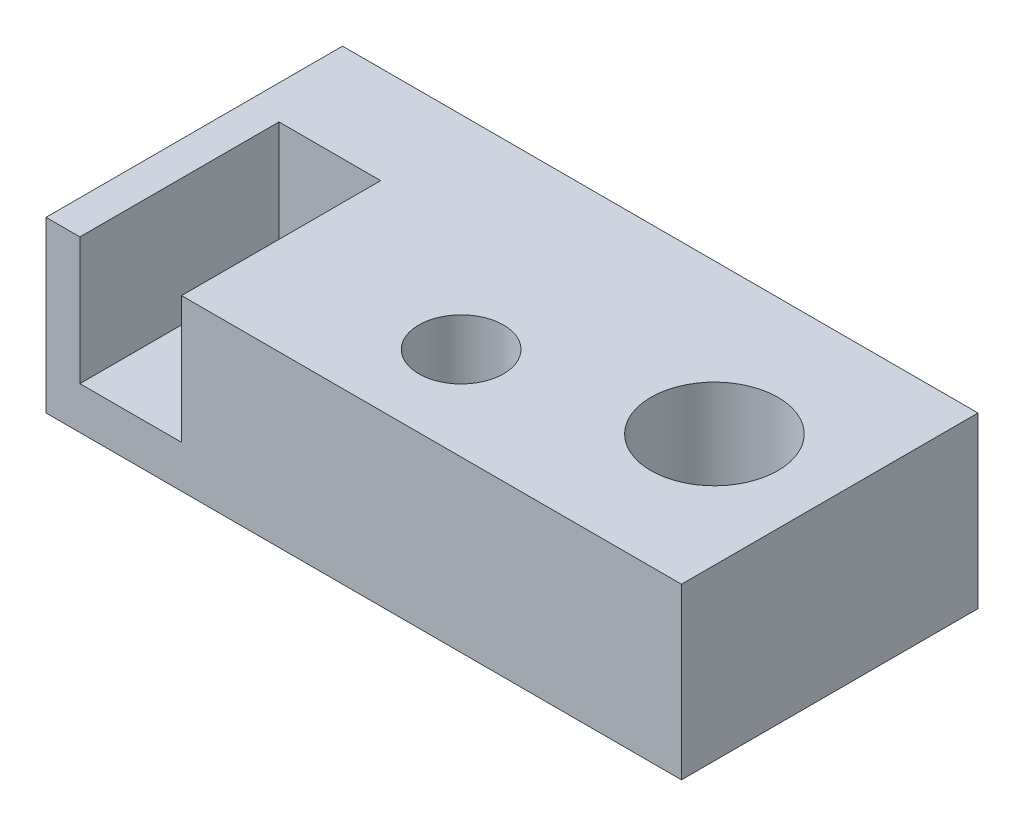
ISO-10303-21;
HEADER;
FILE_DESCRIPTION(('STEP AP214'),'2;1');
FILE_NAME('part.step','',(''),(''),'','','');
FILE_SCHEMA(('AUTOMOTIVE_DESIGN { 1 0 10303 214 1 1 1 1 }'));
ENDSEC;
DATA;
#1=APPLICATION_CONTEXT('core data for automotive mechanical design processes');
#2=APPLICATION_PROTOCOL_DEFINITION('international standard','automotive_design',2000,#1);
#3=PRODUCT_CONTEXT('',#1,'mechanical');
#4=PRODUCT('Part','Part','',(#3));
#5=PRODUCT_RELATED_PRODUCT_CATEGORY('part','',(#4));
#6=PRODUCT_DEFINITION_FORMATION('','',#4);
#7=PRODUCT_DEFINITION_CONTEXT('part definition',#1,'design');
#8=PRODUCT_DEFINITION('design','',#6,#7);
#9=PRODUCT_DEFINITION_SHAPE('','',#8);
#10=(LENGTH_UNIT() NAMED_UNIT(*) SI_UNIT(.MILLI.,.METRE.));
#11=(NAMED_UNIT(*) PLANE_ANGLE_UNIT() SI_UNIT($,.RADIAN.));
#12=(NAMED_UNIT(*) SI_UNIT($,.STERADIAN.) SOLID_ANGLE_UNIT());
#13=UNCERTAINTY_MEASURE_WITH_UNIT(LENGTH_MEASURE(1.E-05),#10,'distance_accuracy_value','');
#14=(GEOMETRIC_REPRESENTATION_CONTEXT(3) GLOBAL_UNCERTAINTY_ASSIGNED_CONTEXT((#13)) GLOBAL_UNIT_ASSIGNED_CONTEXT((#10,
#11,#12)) REPRESENTATION_CONTEXT('',''));
#15=CARTESIAN_POINT('',(0.,0.,0.));
#16=DIRECTION('',(0.,0.,1.));
#17=DIRECTION('',(1.,0.,0.));
#18=AXIS2_PLACEMENT_3D('',#15,#16,#17);
#19=CARTESIAN_POINT('',(0.,20.,0.));
#20=DIRECTION('',(0.,-1.,0.));
#21=DIRECTION('',(0.,0.,1.));
#22=AXIS2_PLACEMENT_3D('',#19,#20,#21);
#23=PLANE('',#22);
#24=CARTESIAN_POINT('',(0.5,20.,6.50000000000017));
#25=DIRECTION('',(0.,-1.,0.));
#26=DIRECTION('',(0.,0.,-1.));
#27=AXIS2_PLACEMENT_3D('',#24,#25,#26);
#28=CIRCLE('',#27,5.);
#29=CARTESIAN_POINT('',(0.5,20.,1.50000000000017));
#30=VERTEX_POINT('',#29);
#31=EDGE_CURVE('E139',#30,#30,#28,.T.);
#32=ORIENTED_EDGE('',*,*,#31,.T.);
#33=EDGE_LOOP('',(#32));
#34=FACE_BOUND('',#33,.T.);
#35=CARTESIAN_POINT('',(24.0874160820902,20.,0.196874766099198));
#36=DIRECTION('',(0.,-1.,0.));
#37=DIRECTION('',(0.,0.,-1.));
#38=AXIS2_PLACEMENT_3D('',#35,#36,#37);
#39=CIRCLE('',#38,7.5);
#40=CARTESIAN_POINT('',(24.0874160820902,20.,-7.3031252339008));
#41=VERTEX_POINT('',#40);
#42=EDGE_CURVE('E160',#41,#41,#39,.T.);
#43=ORIENTED_EDGE('',*,*,#42,.T.);
#44=EDGE_LOOP('',(#43));
#45=FACE_BOUND('',#44,.T.);
#46=DIRECTION('',(0.,0.,-1.));
#47=VECTOR('',#46,1.);
#48=CARTESIAN_POINT('',(-33.5,20.,17.5));
#49=LINE('',#48,#47);
#50=CARTESIAN_POINT('',(-33.5,20.,17.5));
#51=VERTEX_POINT('',#50);
#52=CARTESIAN_POINT('',(-33.5,20.,-5.99999999999999));
#53=VERTEX_POINT('',#52);
#54=EDGE_CURVE('E144',#51,#53,#49,.T.);
#55=ORIENTED_EDGE('',*,*,#54,.T.);
#56=DIRECTION('',(1.,0.,0.));
#57=VECTOR('',#56,1.);
#58=CARTESIAN_POINT('',(-33.5,20.,-5.99999999999999));
#59=LINE('',#58,#57);
#60=CARTESIAN_POINT('',(-21.5,20.,-5.99999999999999));
#61=VERTEX_POINT('',#60);
#62=EDGE_CURVE('E124',#53,#61,#59,.T.);
#63=ORIENTED_EDGE('',*,*,#62,.T.);
#64=DIRECTION('',(0.,0.,1.));
#65=VECTOR('',#64,1.);
#66=CARTESIAN_POINT('',(-21.5,20.,17.5));
#67=LINE('',#66,#65);
#68=CARTESIAN_POINT('',(-21.5,20.,17.5));
#69=VERTEX_POINT('',#68);
#70=EDGE_CURVE('E134',#61,#69,#67,.T.);
#71=ORIENTED_EDGE('',*,*,#70,.T.);
#72=DIRECTION('',(-1.,0.,0.));
#73=VECTOR('',#72,1.);
#74=CARTESIAN_POINT('',(-37.5,20.,17.5));
#75=LINE('',#74,#73);
#76=CARTESIAN_POINT('',(37.5,20.,17.5));
#77=VERTEX_POINT('',#76);
#78=EDGE_CURVE('E167',#77,#69,#75,.T.);
#79=ORIENTED_EDGE('',*,*,#78,.F.);
#80=DIRECTION('',(0.,0.,1.));
#81=VECTOR('',#80,1.);
#82=CARTESIAN_POINT('',(37.5,20.,-17.5));
#83=LINE('',#82,#81);
#84=CARTESIAN_POINT('',(37.5,20.,-17.5));
#85=VERTEX_POINT('',#84);
#86=EDGE_CURVE('E164',#85,#77,#83,.T.);
#87=ORIENTED_EDGE('',*,*,#86,.F.);
#88=DIRECTION('',(1.,0.,0.));
#89=VECTOR('',#88,1.);
#90=CARTESIAN_POINT('',(-37.5,20.,-17.5));
#91=LINE('',#90,#89);
#92=CARTESIAN_POINT('',(-37.5,20.,-17.5));
#93=VERTEX_POINT('',#92);
#94=EDGE_CURVE('E175',#93,#85,#91,.T.);
#95=ORIENTED_EDGE('',*,*,#94,.F.);
#96=DIRECTION('',(0.,0.,-1.));
#97=VECTOR('',#96,1.);
#98=CARTESIAN_POINT('',(-37.5,20.,-17.5));
#99=LINE('',#98,#97);
#100=CARTESIAN_POINT('',(-37.5,20.,17.5));
#101=VERTEX_POINT('',#100);
#102=EDGE_CURVE('E170',#101,#93,#99,.T.);
#103=ORIENTED_EDGE('',*,*,#102,.F.);
#104=EDGE_CURVE('E165',#51,#101,#75,.T.);
#105=ORIENTED_EDGE('',*,*,#104,.F.);
#106=EDGE_LOOP('',(#55,#63,#71,#79,#87,#95,#103,#105));
#107=FACE_BOUND('',#106,.T.);
#108=ADVANCED_FACE('F41',(#34,#45,#107),#23,.F.);
#109=CARTESIAN_POINT('',(-27.5,20.,0.196874766099198));
#110=DIRECTION('',(0.,-1.,0.));
#111=DIRECTION('',(0.,0.,1.));
#112=AXIS2_PLACEMENT_3D('',#109,#110,#111);
#113=CYLINDRICAL_SURFACE('',#112,4.);
#114=CARTESIAN_POINT('',(-27.5,0.,0.196874766099198));
#115=DIRECTION('',(0.,-1.,0.));
#116=DIRECTION('',(0.,0.,-1.));
#117=AXIS2_PLACEMENT_3D('',#114,#115,#116);
#118=CIRCLE('',#117,4.);
#119=CARTESIAN_POINT('',(-27.5,0.,-3.8031252339008));
#120=VERTEX_POINT('',#119);
#121=EDGE_CURVE('E154',#120,#120,#118,.T.);
#122=ORIENTED_EDGE('',*,*,#121,.T.);
#123=EDGE_LOOP('',(#122));
#124=FACE_BOUND('',#123,.T.);
#125=CARTESIAN_POINT('',(-27.5,5.,0.196874766099198));
#126=DIRECTION('',(0.,-1.,0.));
#127=DIRECTION('',(0.,0.,-1.));
#128=AXIS2_PLACEMENT_3D('',#125,#126,#127);
#129=CIRCLE('',#128,4.);
#130=CARTESIAN_POINT('',(-27.5,5.,-3.8031252339008));
#131=VERTEX_POINT('',#130);
#132=EDGE_CURVE('E44',#131,#131,#129,.T.);
#133=ORIENTED_EDGE('',*,*,#132,.F.);
#134=EDGE_LOOP('',(#133));
#135=FACE_BOUND('',#134,.T.);
#136=ADVANCED_FACE('F214',(#124,#135),#113,.F.);
#137=CARTESIAN_POINT('',(0.,0.,0.));
#138=DIRECTION('',(0.,-1.,0.));
#139=DIRECTION('',(0.,0.,1.));
#140=AXIS2_PLACEMENT_3D('',#137,#138,#139);
#141=PLANE('',#140);
#142=CARTESIAN_POINT('',(0.5,0.,6.50000000000017));
#143=DIRECTION('',(0.,-1.,0.));
#144=DIRECTION('',(0.,0.,-1.));
#145=AXIS2_PLACEMENT_3D('',#142,#143,#144);
#146=CIRCLE('',#145,5.);
#147=CARTESIAN_POINT('',(0.5,0.,1.50000000000017));
#148=VERTEX_POINT('',#147);
#149=EDGE_CURVE('E150',#148,#148,#146,.T.);
#150=ORIENTED_EDGE('',*,*,#149,.F.);
#151=EDGE_LOOP('',(#150));
#152=FACE_BOUND('',#151,.T.);
#153=CARTESIAN_POINT('',(24.0874160820902,0.,0.196874766099198));
#154=DIRECTION('',(0.,-1.,0.));
#155=DIRECTION('',(0.,0.,-1.));
#156=AXIS2_PLACEMENT_3D('',#153,#154,#155);
#157=CIRCLE('',#156,7.5);
#158=CARTESIAN_POINT('',(24.0874160820902,0.,-7.3031252339008));
#159=VERTEX_POINT('',#158);
#160=EDGE_CURVE('E157',#159,#159,#157,.T.);
#161=ORIENTED_EDGE('',*,*,#160,.F.);
#162=EDGE_LOOP('',(#161));
#163=FACE_BOUND('',#162,.T.);
#164=DIRECTION('',(0.,0.,1.));
#165=VECTOR('',#164,1.);
#166=CARTESIAN_POINT('',(37.5,0.,-17.5));
#167=LINE('',#166,#165);
#168=CARTESIAN_POINT('',(37.5,0.,-17.5));
#169=VERTEX_POINT('',#168);
#170=CARTESIAN_POINT('',(37.5,0.,17.5));
#171=VERTEX_POINT('',#170);
#172=EDGE_CURVE('E158',#169,#171,#167,.T.);
#173=ORIENTED_EDGE('',*,*,#172,.T.);
#174=DIRECTION('',(-1.,0.,0.));
#175=VECTOR('',#174,1.);
#176=CARTESIAN_POINT('',(-37.5,0.,17.5));
#177=LINE('',#176,#175);
#178=CARTESIAN_POINT('',(-37.5,0.,17.5));
#179=VERTEX_POINT('',#178);
#180=EDGE_CURVE('E176',#171,#179,#177,.T.);
#181=ORIENTED_EDGE('',*,*,#180,.T.);
#182=DIRECTION('',(0.,0.,-1.));
#183=VECTOR('',#182,1.);
#184=CARTESIAN_POINT('',(-37.5,0.,-17.5));
#185=LINE('',#184,#183);
#186=CARTESIAN_POINT('',(-37.5,0.,-17.5));
#187=VERTEX_POINT('',#186);
#188=EDGE_CURVE('E177',#179,#187,#185,.T.);
#189=ORIENTED_EDGE('',*,*,#188,.T.);
#190=DIRECTION('',(1.,0.,0.));
#191=VECTOR('',#190,1.);
#192=CARTESIAN_POINT('',(-37.5,0.,-17.5));
#193=LINE('',#192,#191);
#194=EDGE_CURVE('E168',#187,#169,#193,.T.);
#195=ORIENTED_EDGE('',*,*,#194,.T.);
#196=EDGE_LOOP('',(#173,#181,#189,#195));
#197=FACE_BOUND('',#196,.T.);
#198=ORIENTED_EDGE('',*,*,#121,.F.);
#199=EDGE_LOOP('',(#198));
#200=FACE_BOUND('',#199,.T.);
#201=ADVANCED_FACE('F191',(#152,#163,#197,#200),#141,.T.);
#202=CARTESIAN_POINT('',(37.5,20.,-17.5));
#203=DIRECTION('',(-1.,0.,0.));
#204=DIRECTION('',(0.,0.,-1.));
#205=AXIS2_PLACEMENT_3D('',#202,#203,#204);
#206=PLANE('',#205);
#207=ORIENTED_EDGE('',*,*,#172,.F.);
#208=DIRECTION('',(0.,-1.,0.));
#209=VECTOR('',#208,1.);
#210=CARTESIAN_POINT('',(37.5,20.,-17.5));
#211=LINE('',#210,#209);
#212=EDGE_CURVE('E67',#85,#169,#211,.T.);
#213=ORIENTED_EDGE('',*,*,#212,.F.);
#214=ORIENTED_EDGE('',*,*,#86,.T.);
#215=DIRECTION('',(0.,-1.,0.));
#216=VECTOR('',#215,1.);
#217=CARTESIAN_POINT('',(37.5,20.,17.5));
#218=LINE('',#217,#216);
#219=EDGE_CURVE('E11',#77,#171,#218,.T.);
#220=ORIENTED_EDGE('',*,*,#219,.T.);
#221=EDGE_LOOP('',(#207,#213,#214,#220));
#222=FACE_BOUND('',#221,.T.);
#223=ADVANCED_FACE('F43',(#222),#206,.F.);
#224=CARTESIAN_POINT('',(-37.5,20.,17.5));
#225=DIRECTION('',(0.,0.,-1.));
#226=DIRECTION('',(1.,0.,0.));
#227=AXIS2_PLACEMENT_3D('',#224,#225,#226);
#228=PLANE('',#227);
#229=DIRECTION('',(-1.,0.,0.));
#230=VECTOR('',#229,1.);
#231=CARTESIAN_POINT('',(-33.5,5.,17.5));
#232=LINE('',#231,#230);
#233=CARTESIAN_POINT('',(-21.5,5.,17.5));
#234=VERTEX_POINT('',#233);
#235=CARTESIAN_POINT('',(-33.5,5.,17.5));
#236=VERTEX_POINT('',#235);
#237=EDGE_CURVE('E127',#234,#236,#232,.T.);
#238=ORIENTED_EDGE('',*,*,#237,.T.);
#239=DIRECTION('',(0.,1.,0.));
#240=VECTOR('',#239,1.);
#241=CARTESIAN_POINT('',(-33.5,5.,17.5));
#242=LINE('',#241,#240);
#243=EDGE_CURVE('E133',#236,#51,#242,.T.);
#244=ORIENTED_EDGE('',*,*,#243,.T.);
#245=ORIENTED_EDGE('',*,*,#104,.T.);
#246=DIRECTION('',(0.,-1.,0.));
#247=VECTOR('',#246,1.);
#248=CARTESIAN_POINT('',(-37.5,20.,17.5));
#249=LINE('',#248,#247);
#250=EDGE_CURVE('E49',#101,#179,#249,.T.);
#251=ORIENTED_EDGE('',*,*,#250,.T.);
#252=ORIENTED_EDGE('',*,*,#180,.F.);
#253=ORIENTED_EDGE('',*,*,#219,.F.);
#254=ORIENTED_EDGE('',*,*,#78,.T.);
#255=DIRECTION('',(0.,1.,0.));
#256=VECTOR('',#255,1.);
#257=CARTESIAN_POINT('',(-21.5,5.,17.5));
#258=LINE('',#257,#256);
#259=EDGE_CURVE('E148',#234,#69,#258,.T.);
#260=ORIENTED_EDGE('',*,*,#259,.F.);
#261=EDGE_LOOP('',(#238,#244,#245,#251,#252,#253,#254,#260));
#262=FACE_BOUND('',#261,.T.);
#263=ADVANCED_FACE('F187',(#262),#228,.F.);
#264=CARTESIAN_POINT('',(-37.5,20.,-17.5));
#265=DIRECTION('',(1.,0.,0.));
#266=DIRECTION('',(0.,0.,1.));
#267=AXIS2_PLACEMENT_3D('',#264,#265,#266);
#268=PLANE('',#267);
#269=ORIENTED_EDGE('',*,*,#188,.F.);
#270=ORIENTED_EDGE('',*,*,#250,.F.);
#271=ORIENTED_EDGE('',*,*,#102,.T.);
#272=DIRECTION('',(0.,-1.,0.));
#273=VECTOR('',#272,1.);
#274=CARTESIAN_POINT('',(-37.5,20.,-17.5));
#275=LINE('',#274,#273);
#276=EDGE_CURVE('E182',#93,#187,#275,.T.);
#277=ORIENTED_EDGE('',*,*,#276,.T.);
#278=EDGE_LOOP('',(#269,#270,#271,#277));
#279=FACE_BOUND('',#278,.T.);
#280=ADVANCED_FACE('F195',(#279),#268,.F.);
#281=CARTESIAN_POINT('',(-37.5,20.,-17.5));
#282=DIRECTION('',(0.,0.,1.));
#283=DIRECTION('',(-1.,0.,0.));
#284=AXIS2_PLACEMENT_3D('',#281,#282,#283);
#285=PLANE('',#284);
#286=ORIENTED_EDGE('',*,*,#194,.F.);
#287=ORIENTED_EDGE('',*,*,#276,.F.);
#288=ORIENTED_EDGE('',*,*,#94,.T.);
#289=ORIENTED_EDGE('',*,*,#212,.T.);
#290=EDGE_LOOP('',(#286,#287,#288,#289));
#291=FACE_BOUND('',#290,.T.);
#292=ADVANCED_FACE('F205',(#291),#285,.F.);
#293=CARTESIAN_POINT('',(24.0874160820902,20.,0.196874766099198));
#294=DIRECTION('',(0.,-1.,0.));
#295=DIRECTION('',(0.,0.,1.));
#296=AXIS2_PLACEMENT_3D('',#293,#294,#295);
#297=CYLINDRICAL_SURFACE('',#296,7.5);
#298=ORIENTED_EDGE('',*,*,#42,.F.);
#299=EDGE_LOOP('',(#298));
#300=FACE_BOUND('',#299,.T.);
#301=ORIENTED_EDGE('',*,*,#160,.T.);
#302=EDGE_LOOP('',(#301));
#303=FACE_BOUND('',#302,.T.);
#304=ADVANCED_FACE('F204',(#300,#303),#297,.F.);
#305=CARTESIAN_POINT('',(-33.5,5.,17.5));
#306=DIRECTION('',(-1.,0.,0.));
#307=DIRECTION('',(0.,0.,-1.));
#308=AXIS2_PLACEMENT_3D('',#305,#306,#307);
#309=PLANE('',#308);
#310=ORIENTED_EDGE('',*,*,#54,.F.);
#311=ORIENTED_EDGE('',*,*,#243,.F.);
#312=DIRECTION('',(0.,0.,-1.));
#313=VECTOR('',#312,1.);
#314=CARTESIAN_POINT('',(-33.5,5.,17.5));
#315=LINE('',#314,#313);
#316=CARTESIAN_POINT('',(-33.5,5.,-5.99999999999999));
#317=VERTEX_POINT('',#316);
#318=EDGE_CURVE('E117',#236,#317,#315,.T.);
#319=ORIENTED_EDGE('',*,*,#318,.T.);
#320=DIRECTION('',(0.,1.,0.));
#321=VECTOR('',#320,1.);
#322=CARTESIAN_POINT('',(-33.5,5.,-5.99999999999999));
#323=LINE('',#322,#321);
#324=EDGE_CURVE('E122',#317,#53,#323,.T.);
#325=ORIENTED_EDGE('',*,*,#324,.T.);
#326=EDGE_LOOP('',(#310,#311,#319,#325));
#327=FACE_BOUND('',#326,.T.);
#328=ADVANCED_FACE('F135',(#327),#309,.F.);
#329=CARTESIAN_POINT('',(-21.5,5.,17.5));
#330=DIRECTION('',(1.,0.,0.));
#331=DIRECTION('',(0.,0.,1.));
#332=AXIS2_PLACEMENT_3D('',#329,#330,#331);
#333=PLANE('',#332);
#334=ORIENTED_EDGE('',*,*,#70,.F.);
#335=DIRECTION('',(0.,1.,0.));
#336=VECTOR('',#335,1.);
#337=CARTESIAN_POINT('',(-21.5,5.,-5.99999999999999));
#338=LINE('',#337,#336);
#339=CARTESIAN_POINT('',(-21.5,5.,-5.99999999999999));
#340=VERTEX_POINT('',#339);
#341=EDGE_CURVE('E129',#340,#61,#338,.T.);
#342=ORIENTED_EDGE('',*,*,#341,.F.);
#343=DIRECTION('',(0.,0.,1.));
#344=VECTOR('',#343,1.);
#345=CARTESIAN_POINT('',(-21.5,5.,17.5));
#346=LINE('',#345,#344);
#347=EDGE_CURVE('E60',#340,#234,#346,.T.);
#348=ORIENTED_EDGE('',*,*,#347,.T.);
#349=ORIENTED_EDGE('',*,*,#259,.T.);
#350=EDGE_LOOP('',(#334,#342,#348,#349));
#351=FACE_BOUND('',#350,.T.);
#352=ADVANCED_FACE('F202',(#351),#333,.F.);
#353=CARTESIAN_POINT('',(-33.5,5.,-5.99999999999999));
#354=DIRECTION('',(0.,0.,-1.));
#355=DIRECTION('',(1.,0.,0.));
#356=AXIS2_PLACEMENT_3D('',#353,#354,#355);
#357=PLANE('',#356);
#358=ORIENTED_EDGE('',*,*,#62,.F.);
#359=ORIENTED_EDGE('',*,*,#324,.F.);
#360=DIRECTION('',(1.,0.,0.));
#361=VECTOR('',#360,1.);
#362=CARTESIAN_POINT('',(-33.5,5.,-5.99999999999999));
#363=LINE('',#362,#361);
#364=EDGE_CURVE('E115',#317,#340,#363,.T.);
#365=ORIENTED_EDGE('',*,*,#364,.T.);
#366=ORIENTED_EDGE('',*,*,#341,.T.);
#367=EDGE_LOOP('',(#358,#359,#365,#366));
#368=FACE_BOUND('',#367,.T.);
#369=ADVANCED_FACE('F121',(#368),#357,.F.);
#370=CARTESIAN_POINT('',(0.,5.,0.));
#371=DIRECTION('',(0.,1.,0.));
#372=DIRECTION('',(0.,0.,-1.));
#373=AXIS2_PLACEMENT_3D('',#370,#371,#372);
#374=PLANE('',#373);
#375=ORIENTED_EDGE('',*,*,#132,.T.);
#376=EDGE_LOOP('',(#375));
#377=FACE_BOUND('',#376,.T.);
#378=ORIENTED_EDGE('',*,*,#318,.F.);
#379=ORIENTED_EDGE('',*,*,#237,.F.);
#380=ORIENTED_EDGE('',*,*,#347,.F.);
#381=ORIENTED_EDGE('',*,*,#364,.F.);
#382=EDGE_LOOP('',(#378,#379,#380,#381));
#383=FACE_BOUND('',#382,.T.);
#384=ADVANCED_FACE('F114',(#377,#383),#374,.T.);
#385=CARTESIAN_POINT('',(0.5,0.,6.50000000000017));
#386=DIRECTION('',(0.,1.,0.));
#387=DIRECTION('',(0.,0.,-1.));
#388=AXIS2_PLACEMENT_3D('',#385,#386,#387);
#389=CYLINDRICAL_SURFACE('',#388,5.);
#390=ORIENTED_EDGE('',*,*,#149,.T.);
#391=EDGE_LOOP('',(#390));
#392=FACE_BOUND('',#391,.T.);
#393=ORIENTED_EDGE('',*,*,#31,.F.);
#394=EDGE_LOOP('',(#393));
#395=FACE_BOUND('',#394,.T.);
#396=ADVANCED_FACE('F239',(#392,#395),#389,.F.);
#397=CLOSED_SHELL('',(#108,#136,#201,#223,#263,#280,#292,#304,#328,#352,#369,#384,#396));
#398=MANIFOLD_SOLID_BREP('B2',#397);
#399=ADVANCED_BREP_SHAPE_REPRESENTATION('',(#18,#398),#14);
#400=SHAPE_DEFINITION_REPRESENTATION(#9,#399);
ENDSEC;
END-ISO-10303-21;
